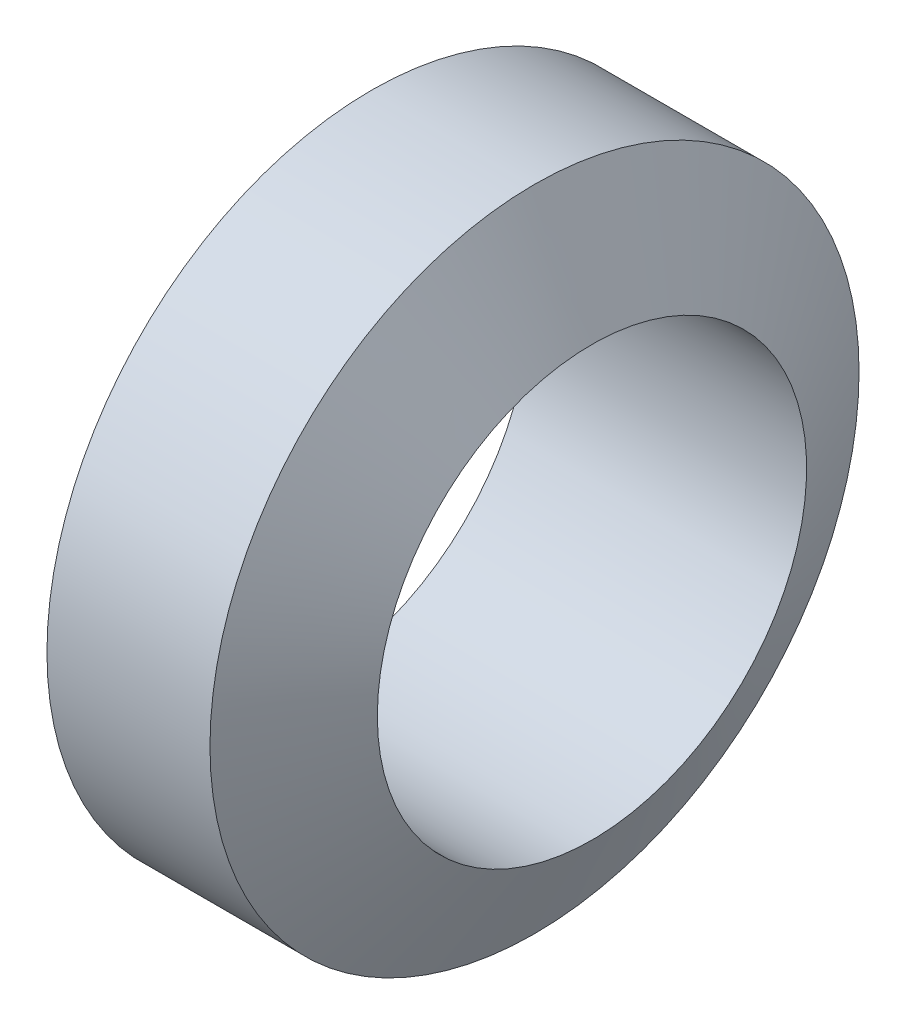
ISO-10303-21;
HEADER;
FILE_DESCRIPTION(('STEP AP214'),'2;1');
FILE_NAME('part.step','',(''),(''),'','','');
FILE_SCHEMA(('AUTOMOTIVE_DESIGN { 1 0 10303 214 1 1 1 1 }'));
ENDSEC;
DATA;
#1=APPLICATION_CONTEXT('core data for automotive mechanical design processes');
#2=APPLICATION_PROTOCOL_DEFINITION('international standard','automotive_design',2000,#1);
#3=PRODUCT_CONTEXT('',#1,'mechanical');
#4=PRODUCT('Part','Part','',(#3));
#5=PRODUCT_RELATED_PRODUCT_CATEGORY('part','',(#4));
#6=PRODUCT_DEFINITION_FORMATION('','',#4);
#7=PRODUCT_DEFINITION_CONTEXT('part definition',#1,'design');
#8=PRODUCT_DEFINITION('design','',#6,#7);
#9=PRODUCT_DEFINITION_SHAPE('','',#8);
#10=(LENGTH_UNIT() NAMED_UNIT(*) SI_UNIT(.MILLI.,.METRE.));
#11=(NAMED_UNIT(*) PLANE_ANGLE_UNIT() SI_UNIT($,.RADIAN.));
#12=(NAMED_UNIT(*) SI_UNIT($,.STERADIAN.) SOLID_ANGLE_UNIT());
#13=UNCERTAINTY_MEASURE_WITH_UNIT(LENGTH_MEASURE(1.E-05),#10,'distance_accuracy_value','');
#14=(GEOMETRIC_REPRESENTATION_CONTEXT(3) GLOBAL_UNCERTAINTY_ASSIGNED_CONTEXT((#13)) GLOBAL_UNIT_ASSIGNED_CONTEXT((#10,
#11,#12)) REPRESENTATION_CONTEXT('',''));
#15=CARTESIAN_POINT('',(0.,0.,0.));
#16=DIRECTION('',(0.,0.,1.));
#17=DIRECTION('',(1.,0.,0.));
#18=AXIS2_PLACEMENT_3D('',#15,#16,#17);
#19=CARTESIAN_POINT('',(-268.372370198152,0.,0.));
#20=DIRECTION('',(-1.,0.,0.));
#21=DIRECTION('',(0.,0.,1.));
#22=AXIS2_PLACEMENT_3D('',#19,#20,#21);
#23=CYLINDRICAL_SURFACE('',#22,7.89999999999989);
#24=CARTESIAN_POINT('',(5.11499999999998,0.,0.));
#25=DIRECTION('',(-1.,0.,0.));
#26=DIRECTION('',(0.,0.,1.));
#27=AXIS2_PLACEMENT_3D('',#24,#25,#26);
#28=CIRCLE('',#27,7.9);
#29=CARTESIAN_POINT('',(5.11499999999998,0.,7.9));
#30=VERTEX_POINT('',#29);
#31=EDGE_CURVE('E49',#30,#30,#28,.T.);
#32=ORIENTED_EDGE('',*,*,#31,.F.);
#33=EDGE_LOOP('',(#32));
#34=FACE_BOUND('',#33,.T.);
#35=CARTESIAN_POINT('',(-5.11500000000004,0.,0.));
#36=DIRECTION('',(-1.,0.,0.));
#37=DIRECTION('',(0.,0.,1.));
#38=AXIS2_PLACEMENT_3D('',#35,#36,#37);
#39=CIRCLE('',#38,7.89999999999978);
#40=CARTESIAN_POINT('',(-5.11500000000004,0.,7.89999999999978));
#41=VERTEX_POINT('',#40);
#42=EDGE_CURVE('E10',#41,#41,#39,.T.);
#43=ORIENTED_EDGE('',*,*,#42,.T.);
#44=EDGE_LOOP('',(#43));
#45=FACE_BOUND('',#44,.T.);
#46=ADVANCED_FACE('F35',(#34,#45),#23,.F.);
#47=CARTESIAN_POINT('',(-3.00000000000006,0.,0.));
#48=DIRECTION('',(1.,0.,0.));
#49=DIRECTION('',(0.,0.,-1.));
#50=AXIS2_PLACEMENT_3D('',#47,#48,#49);
#51=CONICAL_SURFACE('',#50,11.9449999999998,1.08902233484446);
#52=ORIENTED_EDGE('',*,*,#42,.F.);
#53=EDGE_LOOP('',(#52));
#54=FACE_BOUND('',#53,.T.);
#55=CARTESIAN_POINT('',(-3.00000000000006,0.,0.));
#56=DIRECTION('',(-1.,0.,0.));
#57=DIRECTION('',(0.,0.,1.));
#58=AXIS2_PLACEMENT_3D('',#55,#56,#57);
#59=CIRCLE('',#58,11.9449999999998);
#60=CARTESIAN_POINT('',(-3.00000000000006,0.,11.9449999999998));
#61=VERTEX_POINT('',#60);
#62=EDGE_CURVE('E41',#61,#61,#59,.T.);
#63=ORIENTED_EDGE('',*,*,#62,.T.);
#64=EDGE_LOOP('',(#63));
#65=FACE_BOUND('',#64,.T.);
#66=ADVANCED_FACE('F58',(#54,#65),#51,.T.);
#67=CARTESIAN_POINT('',(-268.372370198152,0.,0.));
#68=DIRECTION('',(-1.,0.,0.));
#69=DIRECTION('',(0.,0.,1.));
#70=AXIS2_PLACEMENT_3D('',#67,#68,#69);
#71=CYLINDRICAL_SURFACE('',#70,11.9449999999999);
#72=ORIENTED_EDGE('',*,*,#62,.F.);
#73=EDGE_LOOP('',(#72));
#74=FACE_BOUND('',#73,.T.);
#75=CARTESIAN_POINT('',(3.,0.,0.));
#76=DIRECTION('',(-1.,0.,0.));
#77=DIRECTION('',(0.,0.,1.));
#78=AXIS2_PLACEMENT_3D('',#75,#76,#77);
#79=CIRCLE('',#78,11.945);
#80=CARTESIAN_POINT('',(3.,0.,11.945));
#81=VERTEX_POINT('',#80);
#82=EDGE_CURVE('E45',#81,#81,#79,.T.);
#83=ORIENTED_EDGE('',*,*,#82,.T.);
#84=EDGE_LOOP('',(#83));
#85=FACE_BOUND('',#84,.T.);
#86=ADVANCED_FACE('F62',(#74,#85),#71,.T.);
#87=CARTESIAN_POINT('',(5.11499999999998,0.,0.));
#88=DIRECTION('',(-1.,0.,0.));
#89=DIRECTION('',(0.,0.,1.));
#90=AXIS2_PLACEMENT_3D('',#87,#88,#89);
#91=CONICAL_SURFACE('',#90,7.9,1.08902233484446);
#92=ORIENTED_EDGE('',*,*,#82,.F.);
#93=EDGE_LOOP('',(#92));
#94=FACE_BOUND('',#93,.T.);
#95=ORIENTED_EDGE('',*,*,#31,.T.);
#96=EDGE_LOOP('',(#95));
#97=FACE_BOUND('',#96,.T.);
#98=ADVANCED_FACE('F55',(#94,#97),#91,.T.);
#99=CLOSED_SHELL('',(#46,#66,#86,#98));
#100=MANIFOLD_SOLID_BREP('B2',#99);
#101=ADVANCED_BREP_SHAPE_REPRESENTATION('',(#18,#100),#14);
#102=SHAPE_DEFINITION_REPRESENTATION(#9,#101);
ENDSEC;
END-ISO-10303-21;
